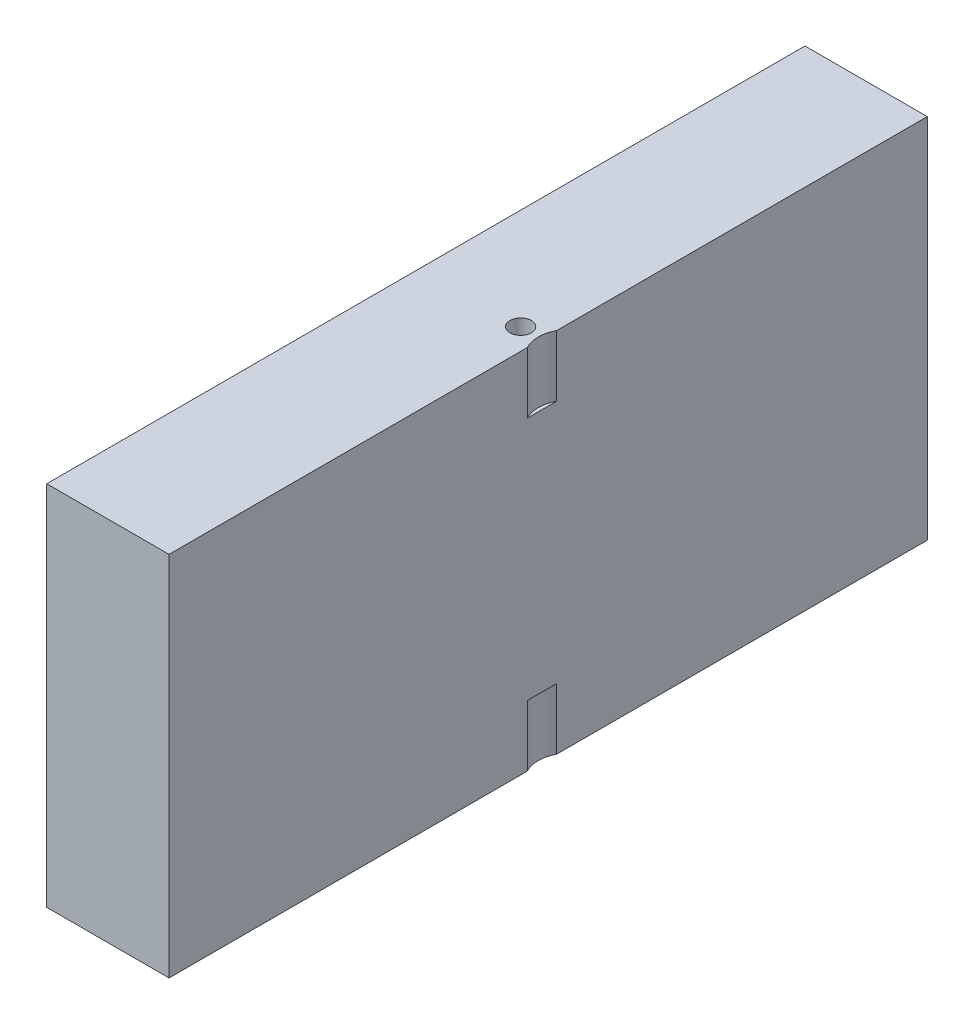
ISO-10303-21;
HEADER;
FILE_DESCRIPTION(('STEP AP214'),'2;1');
FILE_NAME('part.step','',(''),(''),'','','');
FILE_SCHEMA(('AUTOMOTIVE_DESIGN { 1 0 10303 214 1 1 1 1 }'));
ENDSEC;
DATA;
#1=APPLICATION_CONTEXT('core data for automotive mechanical design processes');
#2=APPLICATION_PROTOCOL_DEFINITION('international standard','automotive_design',2000,#1);
#3=PRODUCT_CONTEXT('',#1,'mechanical');
#4=PRODUCT('Part','Part','',(#3));
#5=PRODUCT_RELATED_PRODUCT_CATEGORY('part','',(#4));
#6=PRODUCT_DEFINITION_FORMATION('','',#4);
#7=PRODUCT_DEFINITION_CONTEXT('part definition',#1,'design');
#8=PRODUCT_DEFINITION('design','',#6,#7);
#9=PRODUCT_DEFINITION_SHAPE('','',#8);
#10=(LENGTH_UNIT() NAMED_UNIT(*) SI_UNIT(.MILLI.,.METRE.));
#11=(NAMED_UNIT(*) PLANE_ANGLE_UNIT() SI_UNIT($,.RADIAN.));
#12=(NAMED_UNIT(*) SI_UNIT($,.STERADIAN.) SOLID_ANGLE_UNIT());
#13=UNCERTAINTY_MEASURE_WITH_UNIT(LENGTH_MEASURE(1.E-05),#10,'distance_accuracy_value','');
#14=(GEOMETRIC_REPRESENTATION_CONTEXT(3) GLOBAL_UNCERTAINTY_ASSIGNED_CONTEXT((#13)) GLOBAL_UNIT_ASSIGNED_CONTEXT((#10,
#11,#12)) REPRESENTATION_CONTEXT('',''));
#15=CARTESIAN_POINT('',(0.,0.,0.));
#16=DIRECTION('',(0.,0.,1.));
#17=DIRECTION('',(1.,0.,0.));
#18=AXIS2_PLACEMENT_3D('',#15,#16,#17);
#19=CARTESIAN_POINT('',(10.,-30.,62.));
#20=DIRECTION('',(-1.,0.,0.));
#21=DIRECTION('',(0.,0.,1.));
#22=AXIS2_PLACEMENT_3D('',#19,#20,#21);
#23=PLANE('',#22);
#24=DIRECTION('',(0.,-1.,0.));
#25=VECTOR('',#24,1.);
#26=CARTESIAN_POINT('',(10.,-20.,-1.4));
#27=LINE('',#26,#25);
#28=CARTESIAN_POINT('',(10.,-30.,-1.4));
#29=VERTEX_POINT('',#28);
#30=CARTESIAN_POINT('',(10.,-20.,-1.4));
#31=VERTEX_POINT('',#30);
#32=EDGE_CURVE('E103',#29,#31,#27,.F.);
#33=ORIENTED_EDGE('',*,*,#32,.F.);
#34=DIRECTION('',(0.,0.,-1.));
#35=VECTOR('',#34,1.);
#36=CARTESIAN_POINT('',(10.,-30.,62.));
#37=LINE('',#36,#35);
#38=CARTESIAN_POINT('',(10.,-30.,-62.));
#39=VERTEX_POINT('',#38);
#40=EDGE_CURVE('E153',#29,#39,#37,.T.);
#41=ORIENTED_EDGE('',*,*,#40,.T.);
#42=DIRECTION('',(0.,1.,0.));
#43=VECTOR('',#42,1.);
#44=CARTESIAN_POINT('',(10.,-30.,-62.));
#45=LINE('',#44,#43);
#46=CARTESIAN_POINT('',(10.,30.,-62.));
#47=VERTEX_POINT('',#46);
#48=EDGE_CURVE('E138',#39,#47,#45,.T.);
#49=ORIENTED_EDGE('',*,*,#48,.T.);
#50=DIRECTION('',(0.,0.,-1.));
#51=VECTOR('',#50,1.);
#52=CARTESIAN_POINT('',(10.,30.,62.));
#53=LINE('',#52,#51);
#54=CARTESIAN_POINT('',(10.,30.,-1.4));
#55=VERTEX_POINT('',#54);
#56=EDGE_CURVE('E176',#55,#47,#53,.T.);
#57=ORIENTED_EDGE('',*,*,#56,.F.);
#58=DIRECTION('',(0.,1.,0.));
#59=VECTOR('',#58,1.);
#60=CARTESIAN_POINT('',(10.,20.,-1.4));
#61=LINE('',#60,#59);
#62=CARTESIAN_POINT('',(10.,20.,-1.4));
#63=VERTEX_POINT('',#62);
#64=EDGE_CURVE('E62',#55,#63,#61,.F.);
#65=ORIENTED_EDGE('',*,*,#64,.T.);
#66=DIRECTION('',(0.,0.,-1.));
#67=VECTOR('',#66,1.);
#68=CARTESIAN_POINT('',(10.,20.,62.));
#69=LINE('',#68,#67);
#70=CARTESIAN_POINT('',(10.,20.,3.4));
#71=VERTEX_POINT('',#70);
#72=EDGE_CURVE('E47',#71,#63,#69,.T.);
#73=ORIENTED_EDGE('',*,*,#72,.F.);
#74=DIRECTION('',(0.,1.,0.));
#75=VECTOR('',#74,1.);
#76=CARTESIAN_POINT('',(10.,20.,3.4));
#77=LINE('',#76,#75);
#78=CARTESIAN_POINT('',(10.,30.,3.4));
#79=VERTEX_POINT('',#78);
#80=EDGE_CURVE('E134',#71,#79,#77,.T.);
#81=ORIENTED_EDGE('',*,*,#80,.T.);
#82=CARTESIAN_POINT('',(10.,30.,62.));
#83=VERTEX_POINT('',#82);
#84=EDGE_CURVE('E177',#83,#79,#53,.T.);
#85=ORIENTED_EDGE('',*,*,#84,.F.);
#86=DIRECTION('',(0.,1.,0.));
#87=VECTOR('',#86,1.);
#88=CARTESIAN_POINT('',(10.,-30.,62.));
#89=LINE('',#88,#87);
#90=CARTESIAN_POINT('',(10.,-30.,62.));
#91=VERTEX_POINT('',#90);
#92=EDGE_CURVE('E139',#91,#83,#89,.T.);
#93=ORIENTED_EDGE('',*,*,#92,.F.);
#94=CARTESIAN_POINT('',(10.,-30.,3.4));
#95=VERTEX_POINT('',#94);
#96=EDGE_CURVE('E121',#91,#95,#37,.T.);
#97=ORIENTED_EDGE('',*,*,#96,.T.);
#98=DIRECTION('',(0.,-1.,0.));
#99=VECTOR('',#98,1.);
#100=CARTESIAN_POINT('',(10.,-20.,3.4));
#101=LINE('',#100,#99);
#102=CARTESIAN_POINT('',(10.,-20.,3.4));
#103=VERTEX_POINT('',#102);
#104=EDGE_CURVE('E54',#103,#95,#101,.T.);
#105=ORIENTED_EDGE('',*,*,#104,.F.);
#106=DIRECTION('',(0.,0.,1.));
#107=VECTOR('',#106,1.);
#108=CARTESIAN_POINT('',(10.,-20.,62.));
#109=LINE('',#108,#107);
#110=EDGE_CURVE('E11',#31,#103,#109,.T.);
#111=ORIENTED_EDGE('',*,*,#110,.F.);
#112=EDGE_LOOP('',(#33,#41,#49,#57,#65,#73,#81,#85,#93,#97,#105,#111));
#113=FACE_BOUND('',#112,.T.);
#114=ADVANCED_FACE('F39',(#113),#23,.F.);
#115=CARTESIAN_POINT('',(-10.,30.,62.));
#116=DIRECTION('',(0.,-1.,0.));
#117=DIRECTION('',(0.,0.,-1.));
#118=AXIS2_PLACEMENT_3D('',#115,#116,#117);
#119=PLANE('',#118);
#120=CARTESIAN_POINT('',(6.5,30.,1.));
#121=DIRECTION('',(0.,1.,0.));
#122=DIRECTION('',(0.,0.,1.));
#123=AXIS2_PLACEMENT_3D('',#120,#121,#122);
#124=CIRCLE('',#123,1.75);
#125=CARTESIAN_POINT('',(6.5,30.,2.75));
#126=VERTEX_POINT('',#125);
#127=EDGE_CURVE('E211',#126,#126,#124,.T.);
#128=ORIENTED_EDGE('',*,*,#127,.F.);
#129=EDGE_LOOP('',(#128));
#130=FACE_BOUND('',#129,.T.);
#131=ORIENTED_EDGE('',*,*,#84,.T.);
#132=CARTESIAN_POINT('',(14.5,30.,1.));
#133=DIRECTION('',(0.,1.,0.));
#134=DIRECTION('',(0.,0.,1.));
#135=AXIS2_PLACEMENT_3D('',#132,#133,#134);
#136=CIRCLE('',#135,5.1);
#137=EDGE_CURVE('E112',#55,#79,#136,.T.);
#138=ORIENTED_EDGE('',*,*,#137,.F.);
#139=ORIENTED_EDGE('',*,*,#56,.T.);
#140=DIRECTION('',(-1.,0.,0.));
#141=VECTOR('',#140,1.);
#142=CARTESIAN_POINT('',(-10.,30.,-62.));
#143=LINE('',#142,#141);
#144=CARTESIAN_POINT('',(-10.,30.,-62.));
#145=VERTEX_POINT('',#144);
#146=EDGE_CURVE('E157',#47,#145,#143,.T.);
#147=ORIENTED_EDGE('',*,*,#146,.T.);
#148=DIRECTION('',(0.,0.,-1.));
#149=VECTOR('',#148,1.);
#150=CARTESIAN_POINT('',(-10.,30.,62.));
#151=LINE('',#150,#149);
#152=CARTESIAN_POINT('',(-10.,30.,62.));
#153=VERTEX_POINT('',#152);
#154=EDGE_CURVE('E172',#153,#145,#151,.T.);
#155=ORIENTED_EDGE('',*,*,#154,.F.);
#156=DIRECTION('',(-1.,0.,0.));
#157=VECTOR('',#156,1.);
#158=CARTESIAN_POINT('',(-10.,30.,62.));
#159=LINE('',#158,#157);
#160=EDGE_CURVE('E143',#83,#153,#159,.T.);
#161=ORIENTED_EDGE('',*,*,#160,.F.);
#162=EDGE_LOOP('',(#131,#138,#139,#147,#155,#161));
#163=FACE_BOUND('',#162,.T.);
#164=ADVANCED_FACE('F200',(#130,#163),#119,.F.);
#165=CARTESIAN_POINT('',(-10.,-30.,62.));
#166=DIRECTION('',(1.,0.,0.));
#167=DIRECTION('',(0.,0.,-1.));
#168=AXIS2_PLACEMENT_3D('',#165,#166,#167);
#169=PLANE('',#168);
#170=DIRECTION('',(0.,-1.,0.));
#171=VECTOR('',#170,1.);
#172=CARTESIAN_POINT('',(-10.,-30.,-62.));
#173=LINE('',#172,#171);
#174=CARTESIAN_POINT('',(-10.,-30.,-62.));
#175=VERTEX_POINT('',#174);
#176=EDGE_CURVE('E160',#145,#175,#173,.T.);
#177=ORIENTED_EDGE('',*,*,#176,.T.);
#178=DIRECTION('',(0.,0.,-1.));
#179=VECTOR('',#178,1.);
#180=CARTESIAN_POINT('',(-10.,-30.,62.));
#181=LINE('',#180,#179);
#182=CARTESIAN_POINT('',(-10.,-30.,62.));
#183=VERTEX_POINT('',#182);
#184=EDGE_CURVE('E168',#183,#175,#181,.T.);
#185=ORIENTED_EDGE('',*,*,#184,.F.);
#186=DIRECTION('',(0.,-1.,0.));
#187=VECTOR('',#186,1.);
#188=CARTESIAN_POINT('',(-10.,-30.,62.));
#189=LINE('',#188,#187);
#190=EDGE_CURVE('E147',#153,#183,#189,.T.);
#191=ORIENTED_EDGE('',*,*,#190,.F.);
#192=ORIENTED_EDGE('',*,*,#154,.T.);
#193=EDGE_LOOP('',(#177,#185,#191,#192));
#194=FACE_BOUND('',#193,.T.);
#195=ADVANCED_FACE('F203',(#194),#169,.F.);
#196=CARTESIAN_POINT('',(-10.,-30.,62.));
#197=DIRECTION('',(0.,1.,0.));
#198=DIRECTION('',(0.,0.,1.));
#199=AXIS2_PLACEMENT_3D('',#196,#197,#198);
#200=PLANE('',#199);
#201=CARTESIAN_POINT('',(6.5,-30.,1.));
#202=DIRECTION('',(0.,1.,0.));
#203=DIRECTION('',(0.,0.,1.));
#204=AXIS2_PLACEMENT_3D('',#201,#202,#203);
#205=CIRCLE('',#204,1.75);
#206=CARTESIAN_POINT('',(6.5,-30.,2.75));
#207=VERTEX_POINT('',#206);
#208=EDGE_CURVE('E208',#207,#207,#205,.T.);
#209=ORIENTED_EDGE('',*,*,#208,.T.);
#210=EDGE_LOOP('',(#209));
#211=FACE_BOUND('',#210,.T.);
#212=CARTESIAN_POINT('',(14.5,-30.,1.));
#213=DIRECTION('',(0.,1.,0.));
#214=DIRECTION('',(0.,0.,1.));
#215=AXIS2_PLACEMENT_3D('',#212,#213,#214);
#216=CIRCLE('',#215,5.1);
#217=EDGE_CURVE('E107',#29,#95,#216,.T.);
#218=ORIENTED_EDGE('',*,*,#217,.T.);
#219=ORIENTED_EDGE('',*,*,#96,.F.);
#220=DIRECTION('',(1.,0.,0.));
#221=VECTOR('',#220,1.);
#222=CARTESIAN_POINT('',(-10.,-30.,62.));
#223=LINE('',#222,#221);
#224=EDGE_CURVE('E150',#183,#91,#223,.T.);
#225=ORIENTED_EDGE('',*,*,#224,.F.);
#226=ORIENTED_EDGE('',*,*,#184,.T.);
#227=DIRECTION('',(1.,0.,0.));
#228=VECTOR('',#227,1.);
#229=CARTESIAN_POINT('',(-10.,-30.,-62.));
#230=LINE('',#229,#228);
#231=EDGE_CURVE('E144',#175,#39,#230,.T.);
#232=ORIENTED_EDGE('',*,*,#231,.T.);
#233=ORIENTED_EDGE('',*,*,#40,.F.);
#234=EDGE_LOOP('',(#218,#219,#225,#226,#232,#233));
#235=FACE_BOUND('',#234,.T.);
#236=ADVANCED_FACE('F193',(#211,#235),#200,.F.);
#237=CARTESIAN_POINT('',(0.,0.,62.));
#238=DIRECTION('',(0.,0.,-1.));
#239=DIRECTION('',(-1.,0.,0.));
#240=AXIS2_PLACEMENT_3D('',#237,#238,#239);
#241=PLANE('',#240);
#242=ORIENTED_EDGE('',*,*,#92,.T.);
#243=ORIENTED_EDGE('',*,*,#160,.T.);
#244=ORIENTED_EDGE('',*,*,#190,.T.);
#245=ORIENTED_EDGE('',*,*,#224,.T.);
#246=EDGE_LOOP('',(#242,#243,#244,#245));
#247=FACE_BOUND('',#246,.T.);
#248=ADVANCED_FACE('F205',(#247),#241,.F.);
#249=CARTESIAN_POINT('',(0.,0.,-62.));
#250=DIRECTION('',(0.,0.,-1.));
#251=DIRECTION('',(-1.,0.,0.));
#252=AXIS2_PLACEMENT_3D('',#249,#250,#251);
#253=PLANE('',#252);
#254=ORIENTED_EDGE('',*,*,#48,.F.);
#255=ORIENTED_EDGE('',*,*,#231,.F.);
#256=ORIENTED_EDGE('',*,*,#176,.F.);
#257=ORIENTED_EDGE('',*,*,#146,.F.);
#258=EDGE_LOOP('',(#254,#255,#256,#257));
#259=FACE_BOUND('',#258,.T.);
#260=ADVANCED_FACE('F198',(#259),#253,.T.);
#261=CARTESIAN_POINT('',(14.5,20.,1.));
#262=DIRECTION('',(0.,1.,0.));
#263=DIRECTION('',(0.,0.,1.));
#264=AXIS2_PLACEMENT_3D('',#261,#262,#263);
#265=PLANE('',#264);
#266=ORIENTED_EDGE('',*,*,#72,.T.);
#267=CARTESIAN_POINT('',(14.5,20.,1.));
#268=DIRECTION('',(0.,1.,0.));
#269=DIRECTION('',(0.,0.,1.));
#270=AXIS2_PLACEMENT_3D('',#267,#268,#269);
#271=CIRCLE('',#270,5.1);
#272=EDGE_CURVE('E126',#63,#71,#271,.T.);
#273=ORIENTED_EDGE('',*,*,#272,.T.);
#274=EDGE_LOOP('',(#266,#273));
#275=FACE_BOUND('',#274,.T.);
#276=ADVANCED_FACE('F183',(#275),#265,.T.);
#277=CARTESIAN_POINT('',(14.5,20.,1.));
#278=DIRECTION('',(0.,1.,0.));
#279=DIRECTION('',(0.,0.,1.));
#280=AXIS2_PLACEMENT_3D('',#277,#278,#279);
#281=CYLINDRICAL_SURFACE('',#280,5.1);
#282=ORIENTED_EDGE('',*,*,#272,.F.);
#283=ORIENTED_EDGE('',*,*,#64,.F.);
#284=ORIENTED_EDGE('',*,*,#137,.T.);
#285=ORIENTED_EDGE('',*,*,#80,.F.);
#286=EDGE_LOOP('',(#282,#283,#284,#285));
#287=FACE_BOUND('',#286,.T.);
#288=ADVANCED_FACE('F184',(#287),#281,.F.);
#289=CARTESIAN_POINT('',(14.5,-20.,1.));
#290=DIRECTION('',(0.,-1.,0.));
#291=DIRECTION('',(0.,0.,1.));
#292=AXIS2_PLACEMENT_3D('',#289,#290,#291);
#293=PLANE('',#292);
#294=ORIENTED_EDGE('',*,*,#110,.T.);
#295=CARTESIAN_POINT('',(14.5,-20.,1.));
#296=DIRECTION('',(0.,1.,0.));
#297=DIRECTION('',(0.,0.,1.));
#298=AXIS2_PLACEMENT_3D('',#295,#296,#297);
#299=CIRCLE('',#298,5.1);
#300=EDGE_CURVE('E106',#31,#103,#299,.T.);
#301=ORIENTED_EDGE('',*,*,#300,.F.);
#302=EDGE_LOOP('',(#294,#301));
#303=FACE_BOUND('',#302,.T.);
#304=ADVANCED_FACE('F115',(#303),#293,.T.);
#305=CARTESIAN_POINT('',(14.5,-20.,1.));
#306=DIRECTION('',(0.,-1.,0.));
#307=DIRECTION('',(0.,0.,-1.));
#308=AXIS2_PLACEMENT_3D('',#305,#306,#307);
#309=CYLINDRICAL_SURFACE('',#308,5.1);
#310=ORIENTED_EDGE('',*,*,#32,.T.);
#311=ORIENTED_EDGE('',*,*,#300,.T.);
#312=ORIENTED_EDGE('',*,*,#104,.T.);
#313=ORIENTED_EDGE('',*,*,#217,.F.);
#314=EDGE_LOOP('',(#310,#311,#312,#313));
#315=FACE_BOUND('',#314,.T.);
#316=ADVANCED_FACE('F105',(#315),#309,.F.);
#317=CARTESIAN_POINT('',(6.5,-30.,1.));
#318=DIRECTION('',(0.,1.,0.));
#319=DIRECTION('',(0.,0.,1.));
#320=AXIS2_PLACEMENT_3D('',#317,#318,#319);
#321=CYLINDRICAL_SURFACE('',#320,1.75);
#322=ORIENTED_EDGE('',*,*,#208,.F.);
#323=EDGE_LOOP('',(#322));
#324=FACE_BOUND('',#323,.T.);
#325=ORIENTED_EDGE('',*,*,#127,.T.);
#326=EDGE_LOOP('',(#325));
#327=FACE_BOUND('',#326,.T.);
#328=ADVANCED_FACE('F220',(#324,#327),#321,.F.);
#329=CLOSED_SHELL('',(#114,#164,#195,#236,#248,#260,#276,#288,#304,#316,#328));
#330=MANIFOLD_SOLID_BREP('B2',#329);
#331=ADVANCED_BREP_SHAPE_REPRESENTATION('',(#18,#330),#14);
#332=SHAPE_DEFINITION_REPRESENTATION(#9,#331);
ENDSEC;
END-ISO-10303-21;
